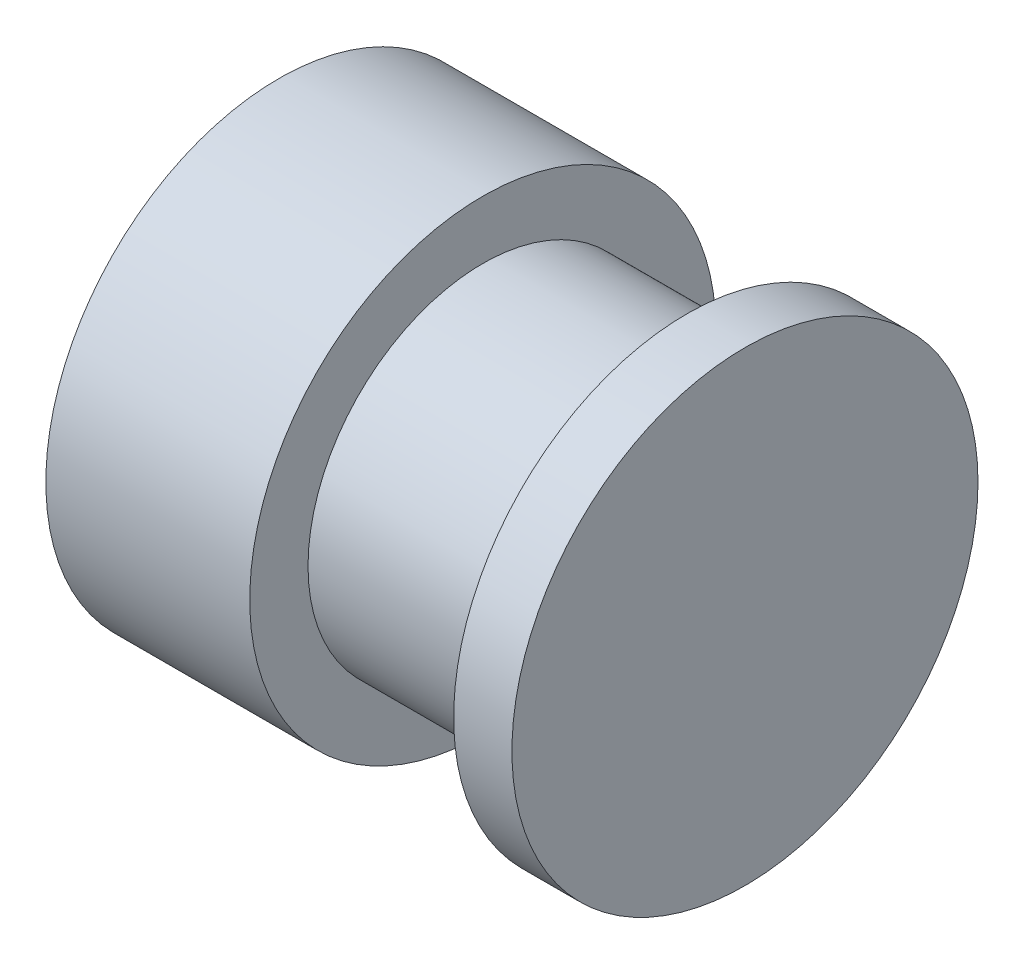
ISO-10303-21;
HEADER;
FILE_DESCRIPTION(('STEP AP214'),'2;1');
FILE_NAME('part.step','',(''),(''),'','','');
FILE_SCHEMA(('AUTOMOTIVE_DESIGN { 1 0 10303 214 1 1 1 1 }'));
ENDSEC;
DATA;
#1=APPLICATION_CONTEXT('core data for automotive mechanical design processes');
#2=APPLICATION_PROTOCOL_DEFINITION('international standard','automotive_design',2000,#1);
#3=PRODUCT_CONTEXT('',#1,'mechanical');
#4=PRODUCT('Part','Part','',(#3));
#5=PRODUCT_RELATED_PRODUCT_CATEGORY('part','',(#4));
#6=PRODUCT_DEFINITION_FORMATION('','',#4);
#7=PRODUCT_DEFINITION_CONTEXT('part definition',#1,'design');
#8=PRODUCT_DEFINITION('design','',#6,#7);
#9=PRODUCT_DEFINITION_SHAPE('','',#8);
#10=(LENGTH_UNIT() NAMED_UNIT(*) SI_UNIT(.MILLI.,.METRE.));
#11=(NAMED_UNIT(*) PLANE_ANGLE_UNIT() SI_UNIT($,.RADIAN.));
#12=(NAMED_UNIT(*) SI_UNIT($,.STERADIAN.) SOLID_ANGLE_UNIT());
#13=UNCERTAINTY_MEASURE_WITH_UNIT(LENGTH_MEASURE(1.E-05),#10,'distance_accuracy_value','');
#14=(GEOMETRIC_REPRESENTATION_CONTEXT(3) GLOBAL_UNCERTAINTY_ASSIGNED_CONTEXT((#13)) GLOBAL_UNIT_ASSIGNED_CONTEXT((#10,
#11,#12)) REPRESENTATION_CONTEXT('',''));
#15=CARTESIAN_POINT('',(0.,0.,0.));
#16=DIRECTION('',(0.,0.,1.));
#17=DIRECTION('',(1.,0.,0.));
#18=AXIS2_PLACEMENT_3D('',#15,#16,#17);
#19=CARTESIAN_POINT('',(0.,0.,0.));
#20=DIRECTION('',(-1.,0.,0.));
#21=DIRECTION('',(0.,0.,1.));
#22=AXIS2_PLACEMENT_3D('',#19,#20,#21);
#23=PLANE('',#22);
#24=CARTESIAN_POINT('',(0.,0.,0.));
#25=DIRECTION('',(1.,0.,0.));
#26=DIRECTION('',(0.,0.,-1.));
#27=AXIS2_PLACEMENT_3D('',#24,#25,#26);
#28=CIRCLE('',#27,8.);
#29=CARTESIAN_POINT('',(0.,0.,-8.));
#30=VERTEX_POINT('',#29);
#31=EDGE_CURVE('E10',#30,#30,#28,.T.);
#32=ORIENTED_EDGE('',*,*,#31,.F.);
#33=EDGE_LOOP('',(#32));
#34=FACE_BOUND('',#33,.T.);
#35=ADVANCED_FACE('F31',(#34),#23,.T.);
#36=CARTESIAN_POINT('',(16.,0.,0.));
#37=DIRECTION('',(1.,0.,0.));
#38=DIRECTION('',(0.,0.,-1.));
#39=AXIS2_PLACEMENT_3D('',#36,#37,#38);
#40=CYLINDRICAL_SURFACE('',#39,8.);
#41=ORIENTED_EDGE('',*,*,#31,.T.);
#42=EDGE_LOOP('',(#41));
#43=FACE_BOUND('',#42,.T.);
#44=CARTESIAN_POINT('',(7.,0.,0.));
#45=DIRECTION('',(1.,0.,0.));
#46=DIRECTION('',(0.,0.,-1.));
#47=AXIS2_PLACEMENT_3D('',#44,#45,#46);
#48=CIRCLE('',#47,8.);
#49=CARTESIAN_POINT('',(7.,0.,-8.));
#50=VERTEX_POINT('',#49);
#51=EDGE_CURVE('E37',#50,#50,#48,.T.);
#52=ORIENTED_EDGE('',*,*,#51,.F.);
#53=EDGE_LOOP('',(#52));
#54=FACE_BOUND('',#53,.T.);
#55=ADVANCED_FACE('F73',(#43,#54),#40,.T.);
#56=CARTESIAN_POINT('',(7.,8.,0.));
#57=DIRECTION('',(1.,0.,0.));
#58=DIRECTION('',(0.,0.,-1.));
#59=AXIS2_PLACEMENT_3D('',#56,#57,#58);
#60=PLANE('',#59);
#61=ORIENTED_EDGE('',*,*,#51,.T.);
#62=EDGE_LOOP('',(#61));
#63=FACE_BOUND('',#62,.T.);
#64=CARTESIAN_POINT('',(7.,0.,0.));
#65=DIRECTION('',(1.,0.,0.));
#66=DIRECTION('',(0.,0.,-1.));
#67=AXIS2_PLACEMENT_3D('',#64,#65,#66);
#68=CIRCLE('',#67,6.);
#69=CARTESIAN_POINT('',(7.,0.,-6.));
#70=VERTEX_POINT('',#69);
#71=EDGE_CURVE('E41',#70,#70,#68,.T.);
#72=ORIENTED_EDGE('',*,*,#71,.F.);
#73=EDGE_LOOP('',(#72));
#74=FACE_BOUND('',#73,.T.);
#75=ADVANCED_FACE('F78',(#63,#74),#60,.T.);
#76=CARTESIAN_POINT('',(16.,0.,0.));
#77=DIRECTION('',(1.,0.,0.));
#78=DIRECTION('',(0.,0.,-1.));
#79=AXIS2_PLACEMENT_3D('',#76,#77,#78);
#80=CYLINDRICAL_SURFACE('',#79,6.);
#81=ORIENTED_EDGE('',*,*,#71,.T.);
#82=EDGE_LOOP('',(#81));
#83=FACE_BOUND('',#82,.T.);
#84=CARTESIAN_POINT('',(14.,0.,0.));
#85=DIRECTION('',(1.,0.,0.));
#86=DIRECTION('',(0.,0.,-1.));
#87=AXIS2_PLACEMENT_3D('',#84,#85,#86);
#88=CIRCLE('',#87,6.);
#89=CARTESIAN_POINT('',(14.,0.,-6.));
#90=VERTEX_POINT('',#89);
#91=EDGE_CURVE('E45',#90,#90,#88,.T.);
#92=ORIENTED_EDGE('',*,*,#91,.F.);
#93=EDGE_LOOP('',(#92));
#94=FACE_BOUND('',#93,.T.);
#95=ADVANCED_FACE('F69',(#83,#94),#80,.T.);
#96=CARTESIAN_POINT('',(14.,6.,0.));
#97=DIRECTION('',(-1.,0.,0.));
#98=DIRECTION('',(0.,0.,1.));
#99=AXIS2_PLACEMENT_3D('',#96,#97,#98);
#100=PLANE('',#99);
#101=ORIENTED_EDGE('',*,*,#91,.T.);
#102=EDGE_LOOP('',(#101));
#103=FACE_BOUND('',#102,.T.);
#104=CARTESIAN_POINT('',(14.,0.,0.));
#105=DIRECTION('',(1.,0.,0.));
#106=DIRECTION('',(0.,0.,-1.));
#107=AXIS2_PLACEMENT_3D('',#104,#105,#106);
#108=CIRCLE('',#107,8.);
#109=CARTESIAN_POINT('',(14.,0.,-8.));
#110=VERTEX_POINT('',#109);
#111=EDGE_CURVE('E50',#110,#110,#108,.T.);
#112=ORIENTED_EDGE('',*,*,#111,.F.);
#113=EDGE_LOOP('',(#112));
#114=FACE_BOUND('',#113,.T.);
#115=ADVANCED_FACE('F61',(#103,#114),#100,.T.);
#116=CARTESIAN_POINT('',(16.,0.,0.));
#117=DIRECTION('',(1.,0.,0.));
#118=DIRECTION('',(0.,0.,-1.));
#119=AXIS2_PLACEMENT_3D('',#116,#117,#118);
#120=CYLINDRICAL_SURFACE('',#119,8.);
#121=ORIENTED_EDGE('',*,*,#111,.T.);
#122=EDGE_LOOP('',(#121));
#123=FACE_BOUND('',#122,.T.);
#124=CARTESIAN_POINT('',(16.,0.,0.));
#125=DIRECTION('',(1.,0.,0.));
#126=DIRECTION('',(0.,0.,-1.));
#127=AXIS2_PLACEMENT_3D('',#124,#125,#126);
#128=CIRCLE('',#127,8.);
#129=CARTESIAN_POINT('',(16.,0.,-8.));
#130=VERTEX_POINT('',#129);
#131=EDGE_CURVE('E53',#130,#130,#128,.T.);
#132=ORIENTED_EDGE('',*,*,#131,.F.);
#133=EDGE_LOOP('',(#132));
#134=FACE_BOUND('',#133,.T.);
#135=ADVANCED_FACE('F59',(#123,#134),#120,.T.);
#136=CARTESIAN_POINT('',(16.,8.,0.));
#137=DIRECTION('',(1.,0.,0.));
#138=DIRECTION('',(0.,0.,-1.));
#139=AXIS2_PLACEMENT_3D('',#136,#137,#138);
#140=PLANE('',#139);
#141=ORIENTED_EDGE('',*,*,#131,.T.);
#142=EDGE_LOOP('',(#141));
#143=FACE_BOUND('',#142,.T.);
#144=ADVANCED_FACE('F57',(#143),#140,.T.);
#145=CLOSED_SHELL('',(#35,#55,#75,#95,#115,#135,#144));
#146=MANIFOLD_SOLID_BREP('B2',#145);
#147=ADVANCED_BREP_SHAPE_REPRESENTATION('',(#18,#146),#14);
#148=SHAPE_DEFINITION_REPRESENTATION(#9,#147);
ENDSEC;
END-ISO-10303-21;
